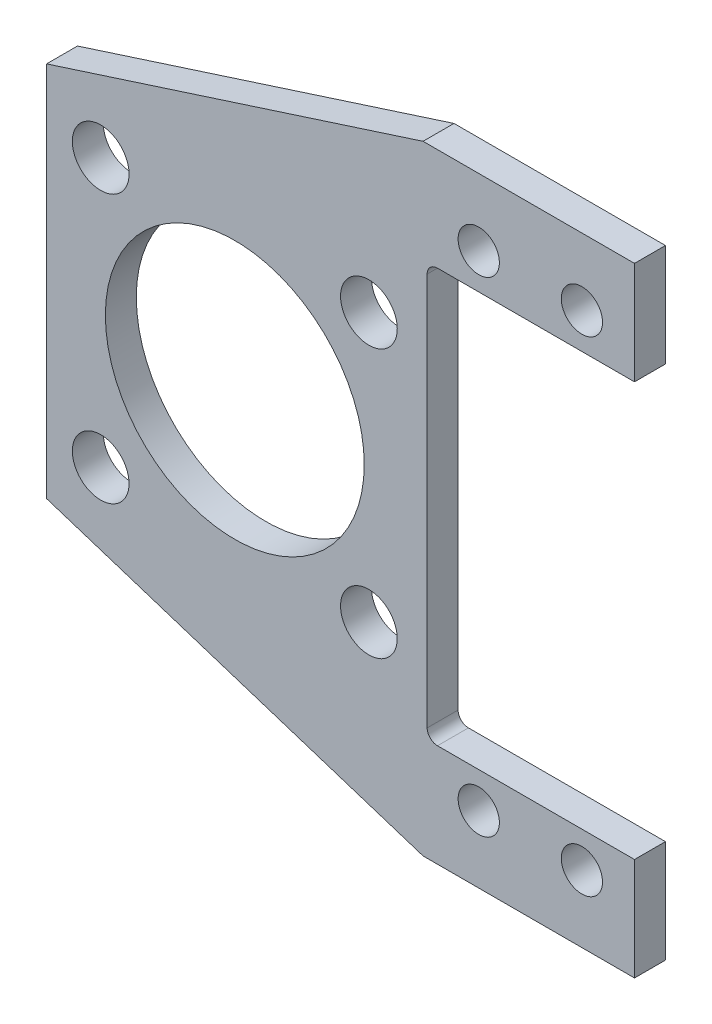
ISO-10303-21;
HEADER;
FILE_DESCRIPTION(('STEP AP214'),'2;1');
FILE_NAME('part.step','',(''),(''),'','','');
FILE_SCHEMA(('AUTOMOTIVE_DESIGN { 1 0 10303 214 1 1 1 1 }'));
ENDSEC;
DATA;
#1=APPLICATION_CONTEXT('core data for automotive mechanical design processes');
#2=APPLICATION_PROTOCOL_DEFINITION('international standard','automotive_design',2000,#1);
#3=PRODUCT_CONTEXT('',#1,'mechanical');
#4=PRODUCT('Part','Part','',(#3));
#5=PRODUCT_RELATED_PRODUCT_CATEGORY('part','',(#4));
#6=PRODUCT_DEFINITION_FORMATION('','',#4);
#7=PRODUCT_DEFINITION_CONTEXT('part definition',#1,'design');
#8=PRODUCT_DEFINITION('design','',#6,#7);
#9=PRODUCT_DEFINITION_SHAPE('','',#8);
#10=(LENGTH_UNIT() NAMED_UNIT(*) SI_UNIT(.MILLI.,.METRE.));
#11=(NAMED_UNIT(*) PLANE_ANGLE_UNIT() SI_UNIT($,.RADIAN.));
#12=(NAMED_UNIT(*) SI_UNIT($,.STERADIAN.) SOLID_ANGLE_UNIT());
#13=UNCERTAINTY_MEASURE_WITH_UNIT(LENGTH_MEASURE(1.E-05),#10,'distance_accuracy_value','');
#14=(GEOMETRIC_REPRESENTATION_CONTEXT(3) GLOBAL_UNCERTAINTY_ASSIGNED_CONTEXT((#13)) GLOBAL_UNIT_ASSIGNED_CONTEXT((#10,
#11,#12)) REPRESENTATION_CONTEXT('',''));
#15=CARTESIAN_POINT('',(0.,0.,0.));
#16=DIRECTION('',(0.,0.,1.));
#17=DIRECTION('',(1.,0.,0.));
#18=AXIS2_PLACEMENT_3D('',#15,#16,#17);
#19=CARTESIAN_POINT('',(19.65,19.05,3.));
#20=DIRECTION('',(0.,0.,-1.));
#21=DIRECTION('',(-1.,0.,0.));
#22=AXIS2_PLACEMENT_3D('',#19,#20,#21);
#23=PLANE('',#22);
#24=DIRECTION('',(-0.95189279529266,-0.30643124232024,0.));
#25=VECTOR('',#24,1.);
#26=CARTESIAN_POINT('',(-18.25,18.25,3.));
#27=LINE('',#26,#25);
#28=CARTESIAN_POINT('',(18.25,30.,3.));
#29=VERTEX_POINT('',#28);
#30=CARTESIAN_POINT('',(-18.25,18.25,3.));
#31=VERTEX_POINT('',#30);
#32=EDGE_CURVE('E206',#29,#31,#27,.T.);
#33=ORIENTED_EDGE('',*,*,#32,.T.);
#34=DIRECTION('',(0.,-1.,0.));
#35=VECTOR('',#34,1.);
#36=CARTESIAN_POINT('',(-18.25,-18.25,3.));
#37=LINE('',#36,#35);
#38=CARTESIAN_POINT('',(-18.25,-18.25,3.));
#39=VERTEX_POINT('',#38);
#40=EDGE_CURVE('E118',#31,#39,#37,.T.);
#41=ORIENTED_EDGE('',*,*,#40,.T.);
#42=DIRECTION('',(0.95189279529266,-0.30643124232024,0.));
#43=VECTOR('',#42,1.);
#44=CARTESIAN_POINT('',(-18.25,-18.25,3.));
#45=LINE('',#44,#43);
#46=CARTESIAN_POINT('',(18.25,-30.,3.));
#47=VERTEX_POINT('',#46);
#48=EDGE_CURVE('E243',#39,#47,#45,.T.);
#49=ORIENTED_EDGE('',*,*,#48,.T.);
#50=DIRECTION('',(1.,0.,0.));
#51=VECTOR('',#50,1.);
#52=CARTESIAN_POINT('',(38.75,-30.,3.));
#53=LINE('',#52,#51);
#54=CARTESIAN_POINT('',(38.75,-30.,3.));
#55=VERTEX_POINT('',#54);
#56=EDGE_CURVE('E263',#47,#55,#53,.T.);
#57=ORIENTED_EDGE('',*,*,#56,.T.);
#58=DIRECTION('',(0.,1.,0.));
#59=VECTOR('',#58,1.);
#60=CARTESIAN_POINT('',(38.75,-30.,3.));
#61=LINE('',#60,#59);
#62=CARTESIAN_POINT('',(38.75,-20.05,3.));
#63=VERTEX_POINT('',#62);
#64=EDGE_CURVE('E259',#55,#63,#61,.T.);
#65=ORIENTED_EDGE('',*,*,#64,.T.);
#66=DIRECTION('',(-1.,0.,0.));
#67=VECTOR('',#66,1.);
#68=CARTESIAN_POINT('',(38.75,-20.05,3.));
#69=LINE('',#68,#67);
#70=CARTESIAN_POINT('',(19.65,-20.05,3.));
#71=VERTEX_POINT('',#70);
#72=EDGE_CURVE('E262',#63,#71,#69,.T.);
#73=ORIENTED_EDGE('',*,*,#72,.T.);
#74=CARTESIAN_POINT('',(19.65,-19.05,3.));
#75=DIRECTION('',(0.,0.,-1.));
#76=DIRECTION('',(-1.,0.,0.));
#77=AXIS2_PLACEMENT_3D('',#74,#75,#76);
#78=CIRCLE('',#77,1.);
#79=CARTESIAN_POINT('',(18.65,-19.05,3.));
#80=VERTEX_POINT('',#79);
#81=EDGE_CURVE('E267',#71,#80,#78,.T.);
#82=ORIENTED_EDGE('',*,*,#81,.T.);
#83=DIRECTION('',(0.,1.,0.));
#84=VECTOR('',#83,1.);
#85=CARTESIAN_POINT('',(18.65,-19.05,3.));
#86=LINE('',#85,#84);
#87=CARTESIAN_POINT('',(18.65,19.05,3.));
#88=VERTEX_POINT('',#87);
#89=EDGE_CURVE('E274',#80,#88,#86,.T.);
#90=ORIENTED_EDGE('',*,*,#89,.T.);
#91=CARTESIAN_POINT('',(19.65,19.05,3.));
#92=DIRECTION('',(0.,0.,-1.));
#93=DIRECTION('',(-1.,0.,0.));
#94=AXIS2_PLACEMENT_3D('',#91,#92,#93);
#95=CIRCLE('',#94,1.);
#96=CARTESIAN_POINT('',(19.65,20.05,3.));
#97=VERTEX_POINT('',#96);
#98=EDGE_CURVE('E149',#88,#97,#95,.T.);
#99=ORIENTED_EDGE('',*,*,#98,.T.);
#100=DIRECTION('',(1.,0.,0.));
#101=VECTOR('',#100,1.);
#102=CARTESIAN_POINT('',(38.75,20.05,3.));
#103=LINE('',#102,#101);
#104=CARTESIAN_POINT('',(38.75,20.05,3.));
#105=VERTEX_POINT('',#104);
#106=EDGE_CURVE('E143',#97,#105,#103,.T.);
#107=ORIENTED_EDGE('',*,*,#106,.T.);
#108=DIRECTION('',(0.,1.,0.));
#109=VECTOR('',#108,1.);
#110=CARTESIAN_POINT('',(38.75,20.05,3.));
#111=LINE('',#110,#109);
#112=CARTESIAN_POINT('',(38.75,30.,3.));
#113=VERTEX_POINT('',#112);
#114=EDGE_CURVE('E147',#105,#113,#111,.T.);
#115=ORIENTED_EDGE('',*,*,#114,.T.);
#116=DIRECTION('',(-1.,0.,0.));
#117=VECTOR('',#116,1.);
#118=CARTESIAN_POINT('',(38.75,30.,3.));
#119=LINE('',#118,#117);
#120=EDGE_CURVE('E63',#113,#29,#119,.T.);
#121=ORIENTED_EDGE('',*,*,#120,.T.);
#122=EDGE_LOOP('',(#33,#41,#49,#57,#65,#73,#82,#90,#99,#107,#115,#121));
#123=FACE_BOUND('',#122,.T.);
#124=CARTESIAN_POINT('',(-13.,-13.,3.));
#125=DIRECTION('',(0.,0.,1.));
#126=DIRECTION('',(1.,0.,0.));
#127=AXIS2_PLACEMENT_3D('',#124,#125,#126);
#128=CIRCLE('',#127,2.75);
#129=CARTESIAN_POINT('',(-10.25,-13.,3.));
#130=VERTEX_POINT('',#129);
#131=EDGE_CURVE('E176',#130,#130,#128,.T.);
#132=ORIENTED_EDGE('',*,*,#131,.F.);
#133=EDGE_LOOP('',(#132));
#134=FACE_BOUND('',#133,.T.);
#135=CARTESIAN_POINT('',(0.,0.,3.));
#136=DIRECTION('',(0.,0.,1.));
#137=DIRECTION('',(1.,0.,0.));
#138=AXIS2_PLACEMENT_3D('',#135,#136,#137);
#139=CIRCLE('',#138,12.55);
#140=CARTESIAN_POINT('',(12.55,0.,3.));
#141=VERTEX_POINT('',#140);
#142=EDGE_CURVE('E404',#141,#141,#139,.T.);
#143=ORIENTED_EDGE('',*,*,#142,.F.);
#144=EDGE_LOOP('',(#143));
#145=FACE_BOUND('',#144,.T.);
#146=CARTESIAN_POINT('',(23.65,-23.5,3.));
#147=DIRECTION('',(0.,0.,1.));
#148=DIRECTION('',(1.,0.,0.));
#149=AXIS2_PLACEMENT_3D('',#146,#147,#148);
#150=CIRCLE('',#149,2.);
#151=CARTESIAN_POINT('',(25.65,-23.5,3.));
#152=VERTEX_POINT('',#151);
#153=EDGE_CURVE('E396',#152,#152,#150,.T.);
#154=ORIENTED_EDGE('',*,*,#153,.F.);
#155=EDGE_LOOP('',(#154));
#156=FACE_BOUND('',#155,.T.);
#157=CARTESIAN_POINT('',(-13.0000000000004,13.,3.));
#158=DIRECTION('',(0.,0.,1.));
#159=DIRECTION('',(1.,0.,0.));
#160=AXIS2_PLACEMENT_3D('',#157,#158,#159);
#161=CIRCLE('',#160,2.75);
#162=CARTESIAN_POINT('',(-10.2500000000004,13.,3.));
#163=VERTEX_POINT('',#162);
#164=EDGE_CURVE('E388',#163,#163,#161,.T.);
#165=ORIENTED_EDGE('',*,*,#164,.F.);
#166=EDGE_LOOP('',(#165));
#167=FACE_BOUND('',#166,.T.);
#168=CARTESIAN_POINT('',(12.9999999999996,13.0000000000003,3.));
#169=DIRECTION('',(0.,0.,1.));
#170=DIRECTION('',(1.,0.,0.));
#171=AXIS2_PLACEMENT_3D('',#168,#169,#170);
#172=CIRCLE('',#171,2.75);
#173=CARTESIAN_POINT('',(15.7499999999996,13.0000000000003,3.));
#174=VERTEX_POINT('',#173);
#175=EDGE_CURVE('E380',#174,#174,#172,.T.);
#176=ORIENTED_EDGE('',*,*,#175,.F.);
#177=EDGE_LOOP('',(#176));
#178=FACE_BOUND('',#177,.T.);
#179=CARTESIAN_POINT('',(13.,-12.9999999999997,3.));
#180=DIRECTION('',(0.,0.,1.));
#181=DIRECTION('',(1.,0.,0.));
#182=AXIS2_PLACEMENT_3D('',#179,#180,#181);
#183=CIRCLE('',#182,2.75);
#184=CARTESIAN_POINT('',(15.75,-12.9999999999997,3.));
#185=VERTEX_POINT('',#184);
#186=EDGE_CURVE('E372',#185,#185,#183,.T.);
#187=ORIENTED_EDGE('',*,*,#186,.F.);
#188=EDGE_LOOP('',(#187));
#189=FACE_BOUND('',#188,.T.);
#190=CARTESIAN_POINT('',(23.65,23.5,3.));
#191=DIRECTION('',(0.,0.,1.));
#192=DIRECTION('',(1.,0.,0.));
#193=AXIS2_PLACEMENT_3D('',#190,#191,#192);
#194=CIRCLE('',#193,2.);
#195=CARTESIAN_POINT('',(25.65,23.5,3.));
#196=VERTEX_POINT('',#195);
#197=EDGE_CURVE('E364',#196,#196,#194,.T.);
#198=ORIENTED_EDGE('',*,*,#197,.F.);
#199=EDGE_LOOP('',(#198));
#200=FACE_BOUND('',#199,.T.);
#201=CARTESIAN_POINT('',(33.65,23.5000000000001,3.));
#202=DIRECTION('',(0.,0.,1.));
#203=DIRECTION('',(1.,0.,0.));
#204=AXIS2_PLACEMENT_3D('',#201,#202,#203);
#205=CIRCLE('',#204,2.);
#206=CARTESIAN_POINT('',(35.65,23.5000000000001,3.));
#207=VERTEX_POINT('',#206);
#208=EDGE_CURVE('E356',#207,#207,#205,.T.);
#209=ORIENTED_EDGE('',*,*,#208,.F.);
#210=EDGE_LOOP('',(#209));
#211=FACE_BOUND('',#210,.T.);
#212=CARTESIAN_POINT('',(33.65,-23.4999999999999,3.));
#213=DIRECTION('',(0.,0.,1.));
#214=DIRECTION('',(1.,0.,0.));
#215=AXIS2_PLACEMENT_3D('',#212,#213,#214);
#216=CIRCLE('',#215,2.);
#217=CARTESIAN_POINT('',(35.65,-23.4999999999999,3.));
#218=VERTEX_POINT('',#217);
#219=EDGE_CURVE('E345',#218,#218,#216,.T.);
#220=ORIENTED_EDGE('',*,*,#219,.F.);
#221=EDGE_LOOP('',(#220));
#222=FACE_BOUND('',#221,.T.);
#223=ADVANCED_FACE('F45',(#123,#134,#145,#156,#167,#178,#189,#200,#211,#222),#23,.F.);
#224=CARTESIAN_POINT('',(19.65,19.05,0.));
#225=DIRECTION('',(0.,0.,-1.));
#226=DIRECTION('',(-1.,0.,0.));
#227=AXIS2_PLACEMENT_3D('',#224,#225,#226);
#228=PLANE('',#227);
#229=CARTESIAN_POINT('',(33.65,23.5000000000001,0.));
#230=DIRECTION('',(0.,0.,1.));
#231=DIRECTION('',(1.,0.,0.));
#232=AXIS2_PLACEMENT_3D('',#229,#230,#231);
#233=CIRCLE('',#232,2.);
#234=CARTESIAN_POINT('',(35.65,23.5000000000001,0.));
#235=VERTEX_POINT('',#234);
#236=EDGE_CURVE('E353',#235,#235,#233,.T.);
#237=ORIENTED_EDGE('',*,*,#236,.T.);
#238=EDGE_LOOP('',(#237));
#239=FACE_BOUND('',#238,.T.);
#240=CARTESIAN_POINT('',(13.,-12.9999999999997,0.));
#241=DIRECTION('',(0.,0.,1.));
#242=DIRECTION('',(1.,0.,0.));
#243=AXIS2_PLACEMENT_3D('',#240,#241,#242);
#244=CIRCLE('',#243,2.75);
#245=CARTESIAN_POINT('',(15.75,-12.9999999999997,0.));
#246=VERTEX_POINT('',#245);
#247=EDGE_CURVE('E368',#246,#246,#244,.T.);
#248=ORIENTED_EDGE('',*,*,#247,.T.);
#249=EDGE_LOOP('',(#248));
#250=FACE_BOUND('',#249,.T.);
#251=CARTESIAN_POINT('',(-13.0000000000004,13.,0.));
#252=DIRECTION('',(0.,0.,1.));
#253=DIRECTION('',(1.,0.,0.));
#254=AXIS2_PLACEMENT_3D('',#251,#252,#253);
#255=CIRCLE('',#254,2.75);
#256=CARTESIAN_POINT('',(-10.2500000000004,13.,0.));
#257=VERTEX_POINT('',#256);
#258=EDGE_CURVE('E384',#257,#257,#255,.T.);
#259=ORIENTED_EDGE('',*,*,#258,.T.);
#260=EDGE_LOOP('',(#259));
#261=FACE_BOUND('',#260,.T.);
#262=CARTESIAN_POINT('',(0.,0.,0.));
#263=DIRECTION('',(0.,0.,1.));
#264=DIRECTION('',(1.,0.,0.));
#265=AXIS2_PLACEMENT_3D('',#262,#263,#264);
#266=CIRCLE('',#265,12.55);
#267=CARTESIAN_POINT('',(12.55,0.,0.));
#268=VERTEX_POINT('',#267);
#269=EDGE_CURVE('E400',#268,#268,#266,.T.);
#270=ORIENTED_EDGE('',*,*,#269,.T.);
#271=EDGE_LOOP('',(#270));
#272=FACE_BOUND('',#271,.T.);
#273=DIRECTION('',(-0.95189279529266,-0.30643124232024,0.));
#274=VECTOR('',#273,1.);
#275=CARTESIAN_POINT('',(-18.25,18.25,0.));
#276=LINE('',#275,#274);
#277=CARTESIAN_POINT('',(18.25,30.,0.));
#278=VERTEX_POINT('',#277);
#279=CARTESIAN_POINT('',(-18.25,18.25,0.));
#280=VERTEX_POINT('',#279);
#281=EDGE_CURVE('E171',#278,#280,#276,.T.);
#282=ORIENTED_EDGE('',*,*,#281,.F.);
#283=DIRECTION('',(-1.,0.,0.));
#284=VECTOR('',#283,1.);
#285=CARTESIAN_POINT('',(38.75,30.,0.));
#286=LINE('',#285,#284);
#287=CARTESIAN_POINT('',(38.75,30.,0.));
#288=VERTEX_POINT('',#287);
#289=EDGE_CURVE('E110',#288,#278,#286,.T.);
#290=ORIENTED_EDGE('',*,*,#289,.F.);
#291=DIRECTION('',(0.,1.,0.));
#292=VECTOR('',#291,1.);
#293=CARTESIAN_POINT('',(38.75,20.05,0.));
#294=LINE('',#293,#292);
#295=CARTESIAN_POINT('',(38.75,20.05,0.));
#296=VERTEX_POINT('',#295);
#297=EDGE_CURVE('E104',#296,#288,#294,.T.);
#298=ORIENTED_EDGE('',*,*,#297,.F.);
#299=DIRECTION('',(1.,0.,0.));
#300=VECTOR('',#299,1.);
#301=CARTESIAN_POINT('',(38.75,20.05,0.));
#302=LINE('',#301,#300);
#303=CARTESIAN_POINT('',(19.65,20.05,0.));
#304=VERTEX_POINT('',#303);
#305=EDGE_CURVE('E158',#304,#296,#302,.T.);
#306=ORIENTED_EDGE('',*,*,#305,.F.);
#307=CARTESIAN_POINT('',(19.65,19.05,0.));
#308=DIRECTION('',(0.,0.,-1.));
#309=DIRECTION('',(-1.,0.,0.));
#310=AXIS2_PLACEMENT_3D('',#307,#308,#309);
#311=CIRCLE('',#310,1.);
#312=CARTESIAN_POINT('',(18.65,19.05,0.));
#313=VERTEX_POINT('',#312);
#314=EDGE_CURVE('E197',#313,#304,#311,.T.);
#315=ORIENTED_EDGE('',*,*,#314,.F.);
#316=DIRECTION('',(0.,1.,0.));
#317=VECTOR('',#316,1.);
#318=CARTESIAN_POINT('',(18.65,-19.05,0.));
#319=LINE('',#318,#317);
#320=CARTESIAN_POINT('',(18.65,-19.05,0.));
#321=VERTEX_POINT('',#320);
#322=EDGE_CURVE('E194',#321,#313,#319,.T.);
#323=ORIENTED_EDGE('',*,*,#322,.F.);
#324=CARTESIAN_POINT('',(19.65,-19.05,0.));
#325=DIRECTION('',(0.,0.,-1.));
#326=DIRECTION('',(-1.,0.,0.));
#327=AXIS2_PLACEMENT_3D('',#324,#325,#326);
#328=CIRCLE('',#327,1.);
#329=CARTESIAN_POINT('',(19.65,-20.05,0.));
#330=VERTEX_POINT('',#329);
#331=EDGE_CURVE('E191',#330,#321,#328,.T.);
#332=ORIENTED_EDGE('',*,*,#331,.F.);
#333=DIRECTION('',(-1.,0.,0.));
#334=VECTOR('',#333,1.);
#335=CARTESIAN_POINT('',(38.75,-20.05,0.));
#336=LINE('',#335,#334);
#337=CARTESIAN_POINT('',(38.75,-20.05,0.));
#338=VERTEX_POINT('',#337);
#339=EDGE_CURVE('E188',#338,#330,#336,.T.);
#340=ORIENTED_EDGE('',*,*,#339,.F.);
#341=DIRECTION('',(0.,1.,0.));
#342=VECTOR('',#341,1.);
#343=CARTESIAN_POINT('',(38.75,-30.,0.));
#344=LINE('',#343,#342);
#345=CARTESIAN_POINT('',(38.75,-30.,0.));
#346=VERTEX_POINT('',#345);
#347=EDGE_CURVE('E185',#346,#338,#344,.T.);
#348=ORIENTED_EDGE('',*,*,#347,.F.);
#349=DIRECTION('',(1.,0.,0.));
#350=VECTOR('',#349,1.);
#351=CARTESIAN_POINT('',(38.75,-30.,0.));
#352=LINE('',#351,#350);
#353=CARTESIAN_POINT('',(18.25,-30.,0.));
#354=VERTEX_POINT('',#353);
#355=EDGE_CURVE('E182',#354,#346,#352,.T.);
#356=ORIENTED_EDGE('',*,*,#355,.F.);
#357=DIRECTION('',(0.95189279529266,-0.30643124232024,0.));
#358=VECTOR('',#357,1.);
#359=CARTESIAN_POINT('',(-18.25,-18.25,0.));
#360=LINE('',#359,#358);
#361=CARTESIAN_POINT('',(-18.25,-18.25,0.));
#362=VERTEX_POINT('',#361);
#363=EDGE_CURVE('E179',#362,#354,#360,.T.);
#364=ORIENTED_EDGE('',*,*,#363,.F.);
#365=DIRECTION('',(0.,-1.,0.));
#366=VECTOR('',#365,1.);
#367=CARTESIAN_POINT('',(-18.25,-18.25,0.));
#368=LINE('',#367,#366);
#369=EDGE_CURVE('E175',#280,#362,#368,.T.);
#370=ORIENTED_EDGE('',*,*,#369,.F.);
#371=EDGE_LOOP('',(#282,#290,#298,#306,#315,#323,#332,#340,#348,#356,#364,#370));
#372=FACE_BOUND('',#371,.T.);
#373=CARTESIAN_POINT('',(-13.,-13.,0.));
#374=DIRECTION('',(0.,0.,1.));
#375=DIRECTION('',(1.,0.,0.));
#376=AXIS2_PLACEMENT_3D('',#373,#374,#375);
#377=CIRCLE('',#376,2.75);
#378=CARTESIAN_POINT('',(-10.25,-13.,0.));
#379=VERTEX_POINT('',#378);
#380=EDGE_CURVE('E408',#379,#379,#377,.T.);
#381=ORIENTED_EDGE('',*,*,#380,.T.);
#382=EDGE_LOOP('',(#381));
#383=FACE_BOUND('',#382,.T.);
#384=CARTESIAN_POINT('',(23.65,-23.5,0.));
#385=DIRECTION('',(0.,0.,1.));
#386=DIRECTION('',(1.,0.,0.));
#387=AXIS2_PLACEMENT_3D('',#384,#385,#386);
#388=CIRCLE('',#387,2.);
#389=CARTESIAN_POINT('',(25.65,-23.5,0.));
#390=VERTEX_POINT('',#389);
#391=EDGE_CURVE('E392',#390,#390,#388,.T.);
#392=ORIENTED_EDGE('',*,*,#391,.T.);
#393=EDGE_LOOP('',(#392));
#394=FACE_BOUND('',#393,.T.);
#395=CARTESIAN_POINT('',(12.9999999999996,13.0000000000003,0.));
#396=DIRECTION('',(0.,0.,1.));
#397=DIRECTION('',(1.,0.,0.));
#398=AXIS2_PLACEMENT_3D('',#395,#396,#397);
#399=CIRCLE('',#398,2.75);
#400=CARTESIAN_POINT('',(15.7499999999996,13.0000000000003,0.));
#401=VERTEX_POINT('',#400);
#402=EDGE_CURVE('E376',#401,#401,#399,.T.);
#403=ORIENTED_EDGE('',*,*,#402,.T.);
#404=EDGE_LOOP('',(#403));
#405=FACE_BOUND('',#404,.T.);
#406=CARTESIAN_POINT('',(23.65,23.5,0.));
#407=DIRECTION('',(0.,0.,1.));
#408=DIRECTION('',(1.,0.,0.));
#409=AXIS2_PLACEMENT_3D('',#406,#407,#408);
#410=CIRCLE('',#409,2.);
#411=CARTESIAN_POINT('',(25.65,23.5,0.));
#412=VERTEX_POINT('',#411);
#413=EDGE_CURVE('E360',#412,#412,#410,.T.);
#414=ORIENTED_EDGE('',*,*,#413,.T.);
#415=EDGE_LOOP('',(#414));
#416=FACE_BOUND('',#415,.T.);
#417=CARTESIAN_POINT('',(33.65,-23.4999999999999,0.));
#418=DIRECTION('',(0.,0.,1.));
#419=DIRECTION('',(1.,0.,0.));
#420=AXIS2_PLACEMENT_3D('',#417,#418,#419);
#421=CIRCLE('',#420,2.);
#422=CARTESIAN_POINT('',(35.65,-23.4999999999999,0.));
#423=VERTEX_POINT('',#422);
#424=EDGE_CURVE('E348',#423,#423,#421,.T.);
#425=ORIENTED_EDGE('',*,*,#424,.T.);
#426=EDGE_LOOP('',(#425));
#427=FACE_BOUND('',#426,.T.);
#428=ADVANCED_FACE('F247',(#239,#250,#261,#272,#372,#383,#394,#405,#416,#427),#228,.T.);
#429=CARTESIAN_POINT('',(-18.25,18.25,3.));
#430=DIRECTION('',(0.30643124232024,-0.95189279529266,0.));
#431=DIRECTION('',(0.95189279529266,0.30643124232024,0.));
#432=AXIS2_PLACEMENT_3D('',#429,#430,#431);
#433=PLANE('',#432);
#434=ORIENTED_EDGE('',*,*,#281,.T.);
#435=DIRECTION('',(0.,0.,-1.));
#436=VECTOR('',#435,1.);
#437=CARTESIAN_POINT('',(-18.25,18.25,3.));
#438=LINE('',#437,#436);
#439=EDGE_CURVE('E11',#31,#280,#438,.T.);
#440=ORIENTED_EDGE('',*,*,#439,.F.);
#441=ORIENTED_EDGE('',*,*,#32,.F.);
#442=DIRECTION('',(0.,0.,-1.));
#443=VECTOR('',#442,1.);
#444=CARTESIAN_POINT('',(18.25,30.,3.));
#445=LINE('',#444,#443);
#446=EDGE_CURVE('E167',#29,#278,#445,.T.);
#447=ORIENTED_EDGE('',*,*,#446,.T.);
#448=EDGE_LOOP('',(#434,#440,#441,#447));
#449=FACE_BOUND('',#448,.T.);
#450=ADVANCED_FACE('F47',(#449),#433,.F.);
#451=CARTESIAN_POINT('',(-18.25,-18.25,3.));
#452=DIRECTION('',(1.,0.,0.));
#453=DIRECTION('',(0.,0.,-1.));
#454=AXIS2_PLACEMENT_3D('',#451,#452,#453);
#455=PLANE('',#454);
#456=ORIENTED_EDGE('',*,*,#369,.T.);
#457=DIRECTION('',(0.,0.,-1.));
#458=VECTOR('',#457,1.);
#459=CARTESIAN_POINT('',(-18.25,-18.25,3.));
#460=LINE('',#459,#458);
#461=EDGE_CURVE('E55',#39,#362,#460,.T.);
#462=ORIENTED_EDGE('',*,*,#461,.F.);
#463=ORIENTED_EDGE('',*,*,#40,.F.);
#464=ORIENTED_EDGE('',*,*,#439,.T.);
#465=EDGE_LOOP('',(#456,#462,#463,#464));
#466=FACE_BOUND('',#465,.T.);
#467=ADVANCED_FACE('F580',(#466),#455,.F.);
#468=CARTESIAN_POINT('',(-18.25,-18.25,3.));
#469=DIRECTION('',(0.30643124232024,0.95189279529266,0.));
#470=DIRECTION('',(-0.95189279529266,0.30643124232024,0.));
#471=AXIS2_PLACEMENT_3D('',#468,#469,#470);
#472=PLANE('',#471);
#473=ORIENTED_EDGE('',*,*,#363,.T.);
#474=DIRECTION('',(0.,0.,-1.));
#475=VECTOR('',#474,1.);
#476=CARTESIAN_POINT('',(18.25,-30.,3.));
#477=LINE('',#476,#475);
#478=EDGE_CURVE('E233',#47,#354,#477,.T.);
#479=ORIENTED_EDGE('',*,*,#478,.F.);
#480=ORIENTED_EDGE('',*,*,#48,.F.);
#481=ORIENTED_EDGE('',*,*,#461,.T.);
#482=EDGE_LOOP('',(#473,#479,#480,#481));
#483=FACE_BOUND('',#482,.T.);
#484=ADVANCED_FACE('F241',(#483),#472,.F.);
#485=CARTESIAN_POINT('',(38.75,-30.,3.));
#486=DIRECTION('',(0.,1.,0.));
#487=DIRECTION('',(0.,0.,1.));
#488=AXIS2_PLACEMENT_3D('',#485,#486,#487);
#489=PLANE('',#488);
#490=ORIENTED_EDGE('',*,*,#355,.T.);
#491=DIRECTION('',(0.,0.,-1.));
#492=VECTOR('',#491,1.);
#493=CARTESIAN_POINT('',(38.75,-30.,3.));
#494=LINE('',#493,#492);
#495=EDGE_CURVE('E229',#55,#346,#494,.T.);
#496=ORIENTED_EDGE('',*,*,#495,.F.);
#497=ORIENTED_EDGE('',*,*,#56,.F.);
#498=ORIENTED_EDGE('',*,*,#478,.T.);
#499=EDGE_LOOP('',(#490,#496,#497,#498));
#500=FACE_BOUND('',#499,.T.);
#501=ADVANCED_FACE('F253',(#500),#489,.F.);
#502=CARTESIAN_POINT('',(38.75,-30.,3.));
#503=DIRECTION('',(-1.,0.,0.));
#504=DIRECTION('',(0.,0.,1.));
#505=AXIS2_PLACEMENT_3D('',#502,#503,#504);
#506=PLANE('',#505);
#507=ORIENTED_EDGE('',*,*,#347,.T.);
#508=DIRECTION('',(0.,0.,-1.));
#509=VECTOR('',#508,1.);
#510=CARTESIAN_POINT('',(38.75,-20.05,3.));
#511=LINE('',#510,#509);
#512=EDGE_CURVE('E225',#63,#338,#511,.T.);
#513=ORIENTED_EDGE('',*,*,#512,.F.);
#514=ORIENTED_EDGE('',*,*,#64,.F.);
#515=ORIENTED_EDGE('',*,*,#495,.T.);
#516=EDGE_LOOP('',(#507,#513,#514,#515));
#517=FACE_BOUND('',#516,.T.);
#518=ADVANCED_FACE('F257',(#517),#506,.F.);
#519=CARTESIAN_POINT('',(38.75,-20.05,3.));
#520=DIRECTION('',(0.,-1.,0.));
#521=DIRECTION('',(0.,0.,-1.));
#522=AXIS2_PLACEMENT_3D('',#519,#520,#521);
#523=PLANE('',#522);
#524=ORIENTED_EDGE('',*,*,#339,.T.);
#525=DIRECTION('',(0.,0.,-1.));
#526=VECTOR('',#525,1.);
#527=CARTESIAN_POINT('',(19.65,-20.05,3.));
#528=LINE('',#527,#526);
#529=EDGE_CURVE('E221',#71,#330,#528,.T.);
#530=ORIENTED_EDGE('',*,*,#529,.F.);
#531=ORIENTED_EDGE('',*,*,#72,.F.);
#532=ORIENTED_EDGE('',*,*,#512,.T.);
#533=EDGE_LOOP('',(#524,#530,#531,#532));
#534=FACE_BOUND('',#533,.T.);
#535=ADVANCED_FACE('F545',(#534),#523,.F.);
#536=CARTESIAN_POINT('',(19.65,-19.05,3.));
#537=DIRECTION('',(0.,0.,-1.));
#538=DIRECTION('',(-1.,0.,0.));
#539=AXIS2_PLACEMENT_3D('',#536,#537,#538);
#540=CYLINDRICAL_SURFACE('',#539,1.);
#541=ORIENTED_EDGE('',*,*,#331,.T.);
#542=DIRECTION('',(0.,0.,-1.));
#543=VECTOR('',#542,1.);
#544=CARTESIAN_POINT('',(18.65,-19.05,3.));
#545=LINE('',#544,#543);
#546=EDGE_CURVE('E217',#80,#321,#545,.T.);
#547=ORIENTED_EDGE('',*,*,#546,.F.);
#548=ORIENTED_EDGE('',*,*,#81,.F.);
#549=ORIENTED_EDGE('',*,*,#529,.T.);
#550=EDGE_LOOP('',(#541,#547,#548,#549));
#551=FACE_BOUND('',#550,.T.);
#552=ADVANCED_FACE('F536',(#551),#540,.F.);
#553=CARTESIAN_POINT('',(18.65,-19.05,3.));
#554=DIRECTION('',(-1.,0.,0.));
#555=DIRECTION('',(0.,0.,1.));
#556=AXIS2_PLACEMENT_3D('',#553,#554,#555);
#557=PLANE('',#556);
#558=ORIENTED_EDGE('',*,*,#322,.T.);
#559=DIRECTION('',(0.,0.,-1.));
#560=VECTOR('',#559,1.);
#561=CARTESIAN_POINT('',(18.65,19.05,3.));
#562=LINE('',#561,#560);
#563=EDGE_CURVE('E213',#88,#313,#562,.T.);
#564=ORIENTED_EDGE('',*,*,#563,.F.);
#565=ORIENTED_EDGE('',*,*,#89,.F.);
#566=ORIENTED_EDGE('',*,*,#546,.T.);
#567=EDGE_LOOP('',(#558,#564,#565,#566));
#568=FACE_BOUND('',#567,.T.);
#569=ADVANCED_FACE('F282',(#568),#557,.F.);
#570=CARTESIAN_POINT('',(19.65,19.05,3.));
#571=DIRECTION('',(0.,0.,-1.));
#572=DIRECTION('',(-1.,0.,0.));
#573=AXIS2_PLACEMENT_3D('',#570,#571,#572);
#574=CYLINDRICAL_SURFACE('',#573,1.);
#575=ORIENTED_EDGE('',*,*,#314,.T.);
#576=DIRECTION('',(0.,0.,-1.));
#577=VECTOR('',#576,1.);
#578=CARTESIAN_POINT('',(19.65,20.05,3.));
#579=LINE('',#578,#577);
#580=EDGE_CURVE('E160',#97,#304,#579,.T.);
#581=ORIENTED_EDGE('',*,*,#580,.F.);
#582=ORIENTED_EDGE('',*,*,#98,.F.);
#583=ORIENTED_EDGE('',*,*,#563,.T.);
#584=EDGE_LOOP('',(#575,#581,#582,#583));
#585=FACE_BOUND('',#584,.T.);
#586=ADVANCED_FACE('F286',(#585),#574,.F.);
#587=CARTESIAN_POINT('',(38.75,20.05,3.));
#588=DIRECTION('',(0.,1.,0.));
#589=DIRECTION('',(0.,0.,1.));
#590=AXIS2_PLACEMENT_3D('',#587,#588,#589);
#591=PLANE('',#590);
#592=ORIENTED_EDGE('',*,*,#305,.T.);
#593=DIRECTION('',(0.,0.,-1.));
#594=VECTOR('',#593,1.);
#595=CARTESIAN_POINT('',(38.75,20.05,3.));
#596=LINE('',#595,#594);
#597=EDGE_CURVE('E155',#105,#296,#596,.T.);
#598=ORIENTED_EDGE('',*,*,#597,.F.);
#599=ORIENTED_EDGE('',*,*,#106,.F.);
#600=ORIENTED_EDGE('',*,*,#580,.T.);
#601=EDGE_LOOP('',(#592,#598,#599,#600));
#602=FACE_BOUND('',#601,.T.);
#603=ADVANCED_FACE('F156',(#602),#591,.F.);
#604=CARTESIAN_POINT('',(38.75,20.05,3.));
#605=DIRECTION('',(-1.,0.,0.));
#606=DIRECTION('',(0.,0.,1.));
#607=AXIS2_PLACEMENT_3D('',#604,#605,#606);
#608=PLANE('',#607);
#609=ORIENTED_EDGE('',*,*,#297,.T.);
#610=DIRECTION('',(0.,0.,-1.));
#611=VECTOR('',#610,1.);
#612=CARTESIAN_POINT('',(38.75,30.,3.));
#613=LINE('',#612,#611);
#614=EDGE_CURVE('E161',#113,#288,#613,.T.);
#615=ORIENTED_EDGE('',*,*,#614,.F.);
#616=ORIENTED_EDGE('',*,*,#114,.F.);
#617=ORIENTED_EDGE('',*,*,#597,.T.);
#618=EDGE_LOOP('',(#609,#615,#616,#617));
#619=FACE_BOUND('',#618,.T.);
#620=ADVANCED_FACE('F163',(#619),#608,.F.);
#621=CARTESIAN_POINT('',(38.75,30.,3.));
#622=DIRECTION('',(0.,-1.,0.));
#623=DIRECTION('',(1.,0.,0.));
#624=AXIS2_PLACEMENT_3D('',#621,#622,#623);
#625=PLANE('',#624);
#626=ORIENTED_EDGE('',*,*,#289,.T.);
#627=ORIENTED_EDGE('',*,*,#446,.F.);
#628=ORIENTED_EDGE('',*,*,#120,.F.);
#629=ORIENTED_EDGE('',*,*,#614,.T.);
#630=EDGE_LOOP('',(#626,#627,#628,#629));
#631=FACE_BOUND('',#630,.T.);
#632=ADVANCED_FACE('F290',(#631),#625,.F.);
#633=CARTESIAN_POINT('',(-13.,-13.,3.));
#634=DIRECTION('',(0.,0.,-1.));
#635=DIRECTION('',(-1.,0.,0.));
#636=AXIS2_PLACEMENT_3D('',#633,#634,#635);
#637=CYLINDRICAL_SURFACE('',#636,2.75);
#638=ORIENTED_EDGE('',*,*,#131,.T.);
#639=EDGE_LOOP('',(#638));
#640=FACE_BOUND('',#639,.T.);
#641=ORIENTED_EDGE('',*,*,#380,.F.);
#642=EDGE_LOOP('',(#641));
#643=FACE_BOUND('',#642,.T.);
#644=ADVANCED_FACE('F292',(#640,#643),#637,.F.);
#645=CARTESIAN_POINT('',(0.,0.,3.));
#646=DIRECTION('',(0.,0.,-1.));
#647=DIRECTION('',(-1.,0.,0.));
#648=AXIS2_PLACEMENT_3D('',#645,#646,#647);
#649=CYLINDRICAL_SURFACE('',#648,12.55);
#650=ORIENTED_EDGE('',*,*,#142,.T.);
#651=EDGE_LOOP('',(#650));
#652=FACE_BOUND('',#651,.T.);
#653=ORIENTED_EDGE('',*,*,#269,.F.);
#654=EDGE_LOOP('',(#653));
#655=FACE_BOUND('',#654,.T.);
#656=ADVANCED_FACE('F298',(#652,#655),#649,.F.);
#657=CARTESIAN_POINT('',(23.65,-23.5,3.));
#658=DIRECTION('',(0.,0.,-1.));
#659=DIRECTION('',(-1.,0.,0.));
#660=AXIS2_PLACEMENT_3D('',#657,#658,#659);
#661=CYLINDRICAL_SURFACE('',#660,2.);
#662=ORIENTED_EDGE('',*,*,#153,.T.);
#663=EDGE_LOOP('',(#662));
#664=FACE_BOUND('',#663,.T.);
#665=ORIENTED_EDGE('',*,*,#391,.F.);
#666=EDGE_LOOP('',(#665));
#667=FACE_BOUND('',#666,.T.);
#668=ADVANCED_FACE('F312',(#664,#667),#661,.F.);
#669=CARTESIAN_POINT('',(-13.0000000000004,13.,3.));
#670=DIRECTION('',(0.,0.,-1.));
#671=DIRECTION('',(-1.,0.,0.));
#672=AXIS2_PLACEMENT_3D('',#669,#670,#671);
#673=CYLINDRICAL_SURFACE('',#672,2.75);
#674=ORIENTED_EDGE('',*,*,#164,.T.);
#675=EDGE_LOOP('',(#674));
#676=FACE_BOUND('',#675,.T.);
#677=ORIENTED_EDGE('',*,*,#258,.F.);
#678=EDGE_LOOP('',(#677));
#679=FACE_BOUND('',#678,.T.);
#680=ADVANCED_FACE('F316',(#676,#679),#673,.F.);
#681=CARTESIAN_POINT('',(12.9999999999996,13.0000000000003,3.));
#682=DIRECTION('',(0.,0.,-1.));
#683=DIRECTION('',(-1.,0.,0.));
#684=AXIS2_PLACEMENT_3D('',#681,#682,#683);
#685=CYLINDRICAL_SURFACE('',#684,2.75);
#686=ORIENTED_EDGE('',*,*,#175,.T.);
#687=EDGE_LOOP('',(#686));
#688=FACE_BOUND('',#687,.T.);
#689=ORIENTED_EDGE('',*,*,#402,.F.);
#690=EDGE_LOOP('',(#689));
#691=FACE_BOUND('',#690,.T.);
#692=ADVANCED_FACE('F320',(#688,#691),#685,.F.);
#693=CARTESIAN_POINT('',(13.,-12.9999999999997,3.));
#694=DIRECTION('',(0.,0.,-1.));
#695=DIRECTION('',(-1.,0.,0.));
#696=AXIS2_PLACEMENT_3D('',#693,#694,#695);
#697=CYLINDRICAL_SURFACE('',#696,2.75);
#698=ORIENTED_EDGE('',*,*,#186,.T.);
#699=EDGE_LOOP('',(#698));
#700=FACE_BOUND('',#699,.T.);
#701=ORIENTED_EDGE('',*,*,#247,.F.);
#702=EDGE_LOOP('',(#701));
#703=FACE_BOUND('',#702,.T.);
#704=ADVANCED_FACE('F324',(#700,#703),#697,.F.);
#705=CARTESIAN_POINT('',(23.65,23.5,3.));
#706=DIRECTION('',(0.,0.,-1.));
#707=DIRECTION('',(-1.,0.,0.));
#708=AXIS2_PLACEMENT_3D('',#705,#706,#707);
#709=CYLINDRICAL_SURFACE('',#708,2.);
#710=ORIENTED_EDGE('',*,*,#197,.T.);
#711=EDGE_LOOP('',(#710));
#712=FACE_BOUND('',#711,.T.);
#713=ORIENTED_EDGE('',*,*,#413,.F.);
#714=EDGE_LOOP('',(#713));
#715=FACE_BOUND('',#714,.T.);
#716=ADVANCED_FACE('F328',(#712,#715),#709,.F.);
#717=CARTESIAN_POINT('',(33.65,23.5000000000001,3.));
#718=DIRECTION('',(0.,0.,-1.));
#719=DIRECTION('',(-1.,0.,0.));
#720=AXIS2_PLACEMENT_3D('',#717,#718,#719);
#721=CYLINDRICAL_SURFACE('',#720,2.);
#722=ORIENTED_EDGE('',*,*,#208,.T.);
#723=EDGE_LOOP('',(#722));
#724=FACE_BOUND('',#723,.T.);
#725=ORIENTED_EDGE('',*,*,#236,.F.);
#726=EDGE_LOOP('',(#725));
#727=FACE_BOUND('',#726,.T.);
#728=ADVANCED_FACE('F332',(#724,#727),#721,.F.);
#729=CARTESIAN_POINT('',(33.65,-23.4999999999999,3.));
#730=DIRECTION('',(0.,0.,-1.));
#731=DIRECTION('',(-1.,0.,0.));
#732=AXIS2_PLACEMENT_3D('',#729,#730,#731);
#733=CYLINDRICAL_SURFACE('',#732,2.);
#734=ORIENTED_EDGE('',*,*,#219,.T.);
#735=EDGE_LOOP('',(#734));
#736=FACE_BOUND('',#735,.T.);
#737=ORIENTED_EDGE('',*,*,#424,.F.);
#738=EDGE_LOOP('',(#737));
#739=FACE_BOUND('',#738,.T.);
#740=ADVANCED_FACE('F336',(#736,#739),#733,.F.);
#741=CLOSED_SHELL('',(#223,#428,#450,#467,#484,#501,#518,#535,#552,#569,#586,#603,#620,#632,
#644,#656,#668,#680,#692,#704,#716,#728,#740));
#742=MANIFOLD_SOLID_BREP('B2',#741);
#743=ADVANCED_BREP_SHAPE_REPRESENTATION('',(#18,#742),#14);
#744=SHAPE_DEFINITION_REPRESENTATION(#9,#743);
ENDSEC;
END-ISO-10303-21;
